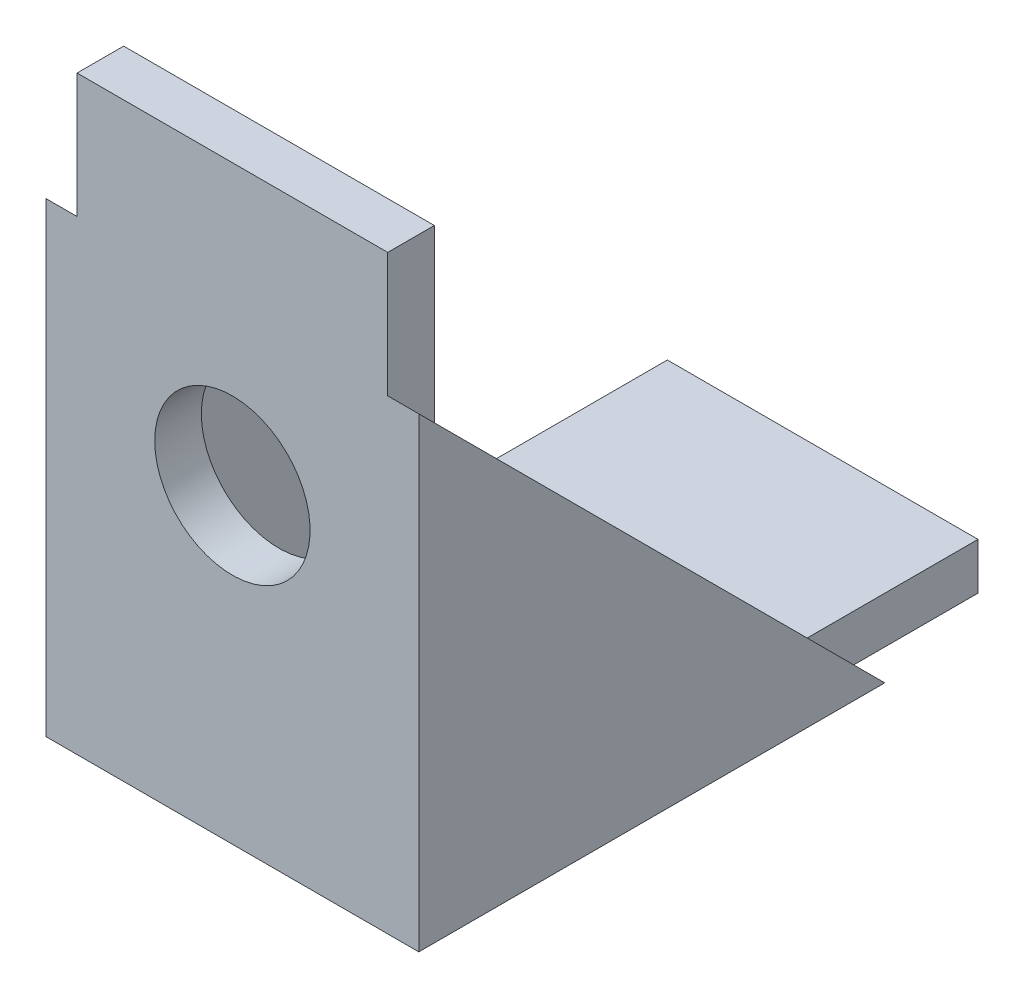
ISO-10303-21;
HEADER;
FILE_DESCRIPTION(('STEP AP214'),'2;1');
FILE_NAME('part.step','',(''),(''),'','','');
FILE_SCHEMA(('AUTOMOTIVE_DESIGN { 1 0 10303 214 1 1 1 1 }'));
ENDSEC;
DATA;
#1=APPLICATION_CONTEXT('core data for automotive mechanical design processes');
#2=APPLICATION_PROTOCOL_DEFINITION('international standard','automotive_design',2000,#1);
#3=PRODUCT_CONTEXT('',#1,'mechanical');
#4=PRODUCT('Part','Part','',(#3));
#5=PRODUCT_RELATED_PRODUCT_CATEGORY('part','',(#4));
#6=PRODUCT_DEFINITION_FORMATION('','',#4);
#7=PRODUCT_DEFINITION_CONTEXT('part definition',#1,'design');
#8=PRODUCT_DEFINITION('design','',#6,#7);
#9=PRODUCT_DEFINITION_SHAPE('','',#8);
#10=(LENGTH_UNIT() NAMED_UNIT(*) SI_UNIT(.MILLI.,.METRE.));
#11=(NAMED_UNIT(*) PLANE_ANGLE_UNIT() SI_UNIT($,.RADIAN.));
#12=(NAMED_UNIT(*) SI_UNIT($,.STERADIAN.) SOLID_ANGLE_UNIT());
#13=UNCERTAINTY_MEASURE_WITH_UNIT(LENGTH_MEASURE(1.E-05),#10,'distance_accuracy_value','');
#14=(GEOMETRIC_REPRESENTATION_CONTEXT(3) GLOBAL_UNCERTAINTY_ASSIGNED_CONTEXT((#13)) GLOBAL_UNIT_ASSIGNED_CONTEXT((#10,
#11,#12)) REPRESENTATION_CONTEXT('',''));
#15=CARTESIAN_POINT('',(0.,0.,0.));
#16=DIRECTION('',(0.,0.,1.));
#17=DIRECTION('',(1.,0.,0.));
#18=AXIS2_PLACEMENT_3D('',#15,#16,#17);
#19=CARTESIAN_POINT('',(20.,0.,0.));
#20=DIRECTION('',(-1.,0.,0.));
#21=DIRECTION('',(0.,0.,1.));
#22=AXIS2_PLACEMENT_3D('',#19,#20,#21);
#23=PLANE('',#22);
#24=DIRECTION('',(0.,0.707106781186547,0.707106781186548));
#25=VECTOR('',#24,1.);
#26=CARTESIAN_POINT('',(20.,30.,0.));
#27=LINE('',#26,#25);
#28=CARTESIAN_POINT('',(20.,0.,-30.));
#29=VERTEX_POINT('',#28);
#30=CARTESIAN_POINT('',(20.,3.,-27.));
#31=VERTEX_POINT('',#30);
#32=EDGE_CURVE('E44',#29,#31,#27,.T.);
#33=ORIENTED_EDGE('',*,*,#32,.F.);
#34=DIRECTION('',(0.,0.,-1.));
#35=VECTOR('',#34,1.);
#36=CARTESIAN_POINT('',(20.,0.,-38.));
#37=LINE('',#36,#35);
#38=CARTESIAN_POINT('',(20.,0.,-38.));
#39=VERTEX_POINT('',#38);
#40=EDGE_CURVE('E145',#29,#39,#37,.T.);
#41=ORIENTED_EDGE('',*,*,#40,.T.);
#42=DIRECTION('',(0.,1.,0.));
#43=VECTOR('',#42,1.);
#44=CARTESIAN_POINT('',(20.,3.,-38.));
#45=LINE('',#44,#43);
#46=CARTESIAN_POINT('',(20.,3.,-38.));
#47=VERTEX_POINT('',#46);
#48=EDGE_CURVE('E199',#39,#47,#45,.T.);
#49=ORIENTED_EDGE('',*,*,#48,.T.);
#50=DIRECTION('',(0.,0.,1.));
#51=VECTOR('',#50,1.);
#52=CARTESIAN_POINT('',(20.,3.,-3.));
#53=LINE('',#52,#51);
#54=EDGE_CURVE('E202',#47,#31,#53,.T.);
#55=ORIENTED_EDGE('',*,*,#54,.T.);
#56=EDGE_LOOP('',(#33,#41,#49,#55));
#57=FACE_BOUND('',#56,.T.);
#58=ADVANCED_FACE('F33',(#57),#23,.F.);
#59=CARTESIAN_POINT('',(20.,27.,-3.));
#60=VERTEX_POINT('',#59);
#61=CARTESIAN_POINT('',(20.,30.,0.));
#62=VERTEX_POINT('',#61);
#63=EDGE_CURVE('E11',#60,#62,#27,.T.);
#64=ORIENTED_EDGE('',*,*,#63,.F.);
#65=DIRECTION('',(0.,1.,0.));
#66=VECTOR('',#65,1.);
#67=CARTESIAN_POINT('',(20.,38.,-3.));
#68=LINE('',#67,#66);
#69=CARTESIAN_POINT('',(20.,38.,-3.));
#70=VERTEX_POINT('',#69);
#71=EDGE_CURVE('E204',#60,#70,#68,.T.);
#72=ORIENTED_EDGE('',*,*,#71,.T.);
#73=DIRECTION('',(0.,0.,1.));
#74=VECTOR('',#73,1.);
#75=CARTESIAN_POINT('',(20.,38.,0.));
#76=LINE('',#75,#74);
#77=CARTESIAN_POINT('',(20.,38.,0.));
#78=VERTEX_POINT('',#77);
#79=EDGE_CURVE('E208',#70,#78,#76,.T.);
#80=ORIENTED_EDGE('',*,*,#79,.T.);
#81=DIRECTION('',(0.,-1.,0.));
#82=VECTOR('',#81,1.);
#83=CARTESIAN_POINT('',(20.,0.,0.));
#84=LINE('',#83,#82);
#85=EDGE_CURVE('E210',#78,#62,#84,.T.);
#86=ORIENTED_EDGE('',*,*,#85,.T.);
#87=EDGE_LOOP('',(#64,#72,#80,#86));
#88=FACE_BOUND('',#87,.T.);
#89=ADVANCED_FACE('F282',(#88),#23,.F.);
#90=CARTESIAN_POINT('',(0.,0.,0.));
#91=DIRECTION('',(-1.,0.,0.));
#92=DIRECTION('',(0.,0.,1.));
#93=AXIS2_PLACEMENT_3D('',#90,#91,#92);
#94=PLANE('',#93);
#95=DIRECTION('',(0.,-0.707106781186547,-0.707106781186547));
#96=VECTOR('',#95,1.);
#97=CARTESIAN_POINT('',(0.,30.,0.));
#98=LINE('',#97,#96);
#99=CARTESIAN_POINT('',(0.,30.,0.));
#100=VERTEX_POINT('',#99);
#101=CARTESIAN_POINT('',(0.,27.,-3.));
#102=VERTEX_POINT('',#101);
#103=EDGE_CURVE('E149',#100,#102,#98,.T.);
#104=ORIENTED_EDGE('',*,*,#103,.F.);
#105=DIRECTION('',(0.,-1.,0.));
#106=VECTOR('',#105,1.);
#107=CARTESIAN_POINT('',(0.,0.,0.));
#108=LINE('',#107,#106);
#109=CARTESIAN_POINT('',(0.,38.,0.));
#110=VERTEX_POINT('',#109);
#111=EDGE_CURVE('E200',#110,#100,#108,.T.);
#112=ORIENTED_EDGE('',*,*,#111,.F.);
#113=DIRECTION('',(0.,0.,1.));
#114=VECTOR('',#113,1.);
#115=CARTESIAN_POINT('',(0.,38.,0.));
#116=LINE('',#115,#114);
#117=CARTESIAN_POINT('',(0.,38.,-3.));
#118=VERTEX_POINT('',#117);
#119=EDGE_CURVE('E224',#118,#110,#116,.T.);
#120=ORIENTED_EDGE('',*,*,#119,.F.);
#121=DIRECTION('',(0.,1.,0.));
#122=VECTOR('',#121,1.);
#123=CARTESIAN_POINT('',(0.,38.,-3.));
#124=LINE('',#123,#122);
#125=EDGE_CURVE('E220',#102,#118,#124,.T.);
#126=ORIENTED_EDGE('',*,*,#125,.F.);
#127=EDGE_LOOP('',(#104,#112,#120,#126));
#128=FACE_BOUND('',#127,.T.);
#129=ADVANCED_FACE('F264',(#128),#94,.T.);
#130=CARTESIAN_POINT('',(20.,0.,-38.));
#131=DIRECTION('',(0.,1.,0.));
#132=DIRECTION('',(0.,0.,1.));
#133=AXIS2_PLACEMENT_3D('',#130,#131,#132);
#134=PLANE('',#133);
#135=CARTESIAN_POINT('',(4.,0.,-12.));
#136=DIRECTION('',(0.,1.,0.));
#137=DIRECTION('',(0.,0.,1.));
#138=AXIS2_PLACEMENT_3D('',#135,#136,#137);
#139=CIRCLE('',#138,1.5);
#140=CARTESIAN_POINT('',(4.,0.,-10.5));
#141=VERTEX_POINT('',#140);
#142=EDGE_CURVE('E174',#141,#141,#139,.T.);
#143=ORIENTED_EDGE('',*,*,#142,.T.);
#144=EDGE_LOOP('',(#143));
#145=FACE_BOUND('',#144,.T.);
#146=CARTESIAN_POINT('',(16.,0.,-24.));
#147=DIRECTION('',(0.,1.,0.));
#148=DIRECTION('',(0.,0.,1.));
#149=AXIS2_PLACEMENT_3D('',#146,#147,#148);
#150=CIRCLE('',#149,1.5);
#151=CARTESIAN_POINT('',(16.,0.,-22.5));
#152=VERTEX_POINT('',#151);
#153=EDGE_CURVE('E181',#152,#152,#150,.T.);
#154=ORIENTED_EDGE('',*,*,#153,.T.);
#155=EDGE_LOOP('',(#154));
#156=FACE_BOUND('',#155,.T.);
#157=CARTESIAN_POINT('',(4.,0.,-24.));
#158=DIRECTION('',(0.,1.,0.));
#159=DIRECTION('',(0.,0.,1.));
#160=AXIS2_PLACEMENT_3D('',#157,#158,#159);
#161=CIRCLE('',#160,1.5);
#162=CARTESIAN_POINT('',(4.,0.,-22.5));
#163=VERTEX_POINT('',#162);
#164=EDGE_CURVE('E187',#163,#163,#161,.T.);
#165=ORIENTED_EDGE('',*,*,#164,.T.);
#166=EDGE_LOOP('',(#165));
#167=FACE_BOUND('',#166,.T.);
#168=CARTESIAN_POINT('',(16.,0.,-12.));
#169=DIRECTION('',(0.,1.,0.));
#170=DIRECTION('',(0.,0.,1.));
#171=AXIS2_PLACEMENT_3D('',#168,#169,#170);
#172=CIRCLE('',#171,1.5);
#173=CARTESIAN_POINT('',(16.,0.,-10.5));
#174=VERTEX_POINT('',#173);
#175=EDGE_CURVE('E192',#174,#174,#172,.T.);
#176=ORIENTED_EDGE('',*,*,#175,.T.);
#177=EDGE_LOOP('',(#176));
#178=FACE_BOUND('',#177,.T.);
#179=DIRECTION('',(-1.,0.,0.));
#180=VECTOR('',#179,1.);
#181=CARTESIAN_POINT('',(20.,0.,0.));
#182=LINE('',#181,#180);
#183=CARTESIAN_POINT('',(22.,0.,0.));
#184=VERTEX_POINT('',#183);
#185=CARTESIAN_POINT('',(-2.,0.,0.));
#186=VERTEX_POINT('',#185);
#187=EDGE_CURVE('E212',#184,#186,#182,.T.);
#188=ORIENTED_EDGE('',*,*,#187,.T.);
#189=DIRECTION('',(0.,0.,1.));
#190=VECTOR('',#189,1.);
#191=CARTESIAN_POINT('',(-2.,0.,-30.));
#192=LINE('',#191,#190);
#193=CARTESIAN_POINT('',(-2.,0.,-30.));
#194=VERTEX_POINT('',#193);
#195=EDGE_CURVE('E153',#194,#186,#192,.T.);
#196=ORIENTED_EDGE('',*,*,#195,.F.);
#197=DIRECTION('',(1.,0.,0.));
#198=VECTOR('',#197,1.);
#199=CARTESIAN_POINT('',(-2.,0.,-30.));
#200=LINE('',#199,#198);
#201=CARTESIAN_POINT('',(0.,0.,-30.));
#202=VERTEX_POINT('',#201);
#203=EDGE_CURVE('E159',#194,#202,#200,.T.);
#204=ORIENTED_EDGE('',*,*,#203,.T.);
#205=DIRECTION('',(0.,0.,-1.));
#206=VECTOR('',#205,1.);
#207=CARTESIAN_POINT('',(0.,0.,-38.));
#208=LINE('',#207,#206);
#209=CARTESIAN_POINT('',(0.,0.,-38.));
#210=VERTEX_POINT('',#209);
#211=EDGE_CURVE('E195',#202,#210,#208,.T.);
#212=ORIENTED_EDGE('',*,*,#211,.T.);
#213=DIRECTION('',(-1.,0.,0.));
#214=VECTOR('',#213,1.);
#215=CARTESIAN_POINT('',(20.,0.,-38.));
#216=LINE('',#215,#214);
#217=EDGE_CURVE('E37',#39,#210,#216,.T.);
#218=ORIENTED_EDGE('',*,*,#217,.F.);
#219=ORIENTED_EDGE('',*,*,#40,.F.);
#220=DIRECTION('',(-1.,0.,0.));
#221=VECTOR('',#220,1.);
#222=CARTESIAN_POINT('',(22.,0.,-30.));
#223=LINE('',#222,#221);
#224=CARTESIAN_POINT('',(22.,0.,-30.));
#225=VERTEX_POINT('',#224);
#226=EDGE_CURVE('E130',#225,#29,#223,.T.);
#227=ORIENTED_EDGE('',*,*,#226,.F.);
#228=DIRECTION('',(0.,0.,-1.));
#229=VECTOR('',#228,1.);
#230=CARTESIAN_POINT('',(22.,0.,-30.));
#231=LINE('',#230,#229);
#232=EDGE_CURVE('E137',#184,#225,#231,.T.);
#233=ORIENTED_EDGE('',*,*,#232,.F.);
#234=EDGE_LOOP('',(#188,#196,#204,#212,#218,#219,#227,#233));
#235=FACE_BOUND('',#234,.T.);
#236=ADVANCED_FACE('F35',(#145,#156,#167,#178,#235),#134,.F.);
#237=CARTESIAN_POINT('',(20.,3.,-38.));
#238=DIRECTION('',(0.,0.,1.));
#239=DIRECTION('',(1.,0.,0.));
#240=AXIS2_PLACEMENT_3D('',#237,#238,#239);
#241=PLANE('',#240);
#242=DIRECTION('',(0.,1.,0.));
#243=VECTOR('',#242,1.);
#244=CARTESIAN_POINT('',(0.,3.,-38.));
#245=LINE('',#244,#243);
#246=CARTESIAN_POINT('',(0.,3.,-38.));
#247=VERTEX_POINT('',#246);
#248=EDGE_CURVE('E214',#210,#247,#245,.T.);
#249=ORIENTED_EDGE('',*,*,#248,.T.);
#250=DIRECTION('',(-1.,0.,0.));
#251=VECTOR('',#250,1.);
#252=CARTESIAN_POINT('',(20.,3.,-38.));
#253=LINE('',#252,#251);
#254=EDGE_CURVE('E237',#47,#247,#253,.T.);
#255=ORIENTED_EDGE('',*,*,#254,.F.);
#256=ORIENTED_EDGE('',*,*,#48,.F.);
#257=ORIENTED_EDGE('',*,*,#217,.T.);
#258=EDGE_LOOP('',(#249,#255,#256,#257));
#259=FACE_BOUND('',#258,.T.);
#260=ADVANCED_FACE('F275',(#259),#241,.F.);
#261=CARTESIAN_POINT('',(20.,3.,-3.));
#262=DIRECTION('',(0.,-1.,0.));
#263=DIRECTION('',(0.,0.,-1.));
#264=AXIS2_PLACEMENT_3D('',#261,#262,#263);
#265=PLANE('',#264);
#266=CARTESIAN_POINT('',(4.,3.,-12.));
#267=DIRECTION('',(0.,1.,0.));
#268=DIRECTION('',(0.,0.,1.));
#269=AXIS2_PLACEMENT_3D('',#266,#267,#268);
#270=CIRCLE('',#269,1.5);
#271=CARTESIAN_POINT('',(4.,3.,-10.5));
#272=VERTEX_POINT('',#271);
#273=EDGE_CURVE('E178',#272,#272,#270,.T.);
#274=ORIENTED_EDGE('',*,*,#273,.F.);
#275=EDGE_LOOP('',(#274));
#276=FACE_BOUND('',#275,.T.);
#277=CARTESIAN_POINT('',(16.,3.,-24.));
#278=DIRECTION('',(0.,1.,0.));
#279=DIRECTION('',(0.,0.,1.));
#280=AXIS2_PLACEMENT_3D('',#277,#278,#279);
#281=CIRCLE('',#280,1.5);
#282=CARTESIAN_POINT('',(16.,3.,-22.5));
#283=VERTEX_POINT('',#282);
#284=EDGE_CURVE('E184',#283,#283,#281,.T.);
#285=ORIENTED_EDGE('',*,*,#284,.F.);
#286=EDGE_LOOP('',(#285));
#287=FACE_BOUND('',#286,.T.);
#288=CARTESIAN_POINT('',(4.,3.,-24.));
#289=DIRECTION('',(0.,1.,0.));
#290=DIRECTION('',(0.,0.,1.));
#291=AXIS2_PLACEMENT_3D('',#288,#289,#290);
#292=CIRCLE('',#291,1.5);
#293=CARTESIAN_POINT('',(4.,3.,-22.5));
#294=VERTEX_POINT('',#293);
#295=EDGE_CURVE('E171',#294,#294,#292,.T.);
#296=ORIENTED_EDGE('',*,*,#295,.F.);
#297=EDGE_LOOP('',(#296));
#298=FACE_BOUND('',#297,.T.);
#299=CARTESIAN_POINT('',(16.,3.,-12.));
#300=DIRECTION('',(0.,1.,0.));
#301=DIRECTION('',(0.,0.,1.));
#302=AXIS2_PLACEMENT_3D('',#299,#300,#301);
#303=CIRCLE('',#302,1.5);
#304=CARTESIAN_POINT('',(16.,3.,-10.5));
#305=VERTEX_POINT('',#304);
#306=EDGE_CURVE('E177',#305,#305,#303,.T.);
#307=ORIENTED_EDGE('',*,*,#306,.F.);
#308=EDGE_LOOP('',(#307));
#309=FACE_BOUND('',#308,.T.);
#310=DIRECTION('',(0.,0.,1.));
#311=VECTOR('',#310,1.);
#312=CARTESIAN_POINT('',(0.,3.,-3.));
#313=LINE('',#312,#311);
#314=CARTESIAN_POINT('',(0.,3.,-27.));
#315=VERTEX_POINT('',#314);
#316=EDGE_CURVE('E217',#247,#315,#313,.T.);
#317=ORIENTED_EDGE('',*,*,#316,.T.);
#318=CARTESIAN_POINT('',(0.,3.,-3.));
#319=VERTEX_POINT('',#318);
#320=EDGE_CURVE('E216',#315,#319,#313,.T.);
#321=ORIENTED_EDGE('',*,*,#320,.T.);
#322=DIRECTION('',(-1.,0.,0.));
#323=VECTOR('',#322,1.);
#324=CARTESIAN_POINT('',(20.,3.,-3.));
#325=LINE('',#324,#323);
#326=CARTESIAN_POINT('',(20.,3.,-3.));
#327=VERTEX_POINT('',#326);
#328=EDGE_CURVE('E235',#327,#319,#325,.T.);
#329=ORIENTED_EDGE('',*,*,#328,.F.);
#330=EDGE_CURVE('E58',#31,#327,#53,.T.);
#331=ORIENTED_EDGE('',*,*,#330,.F.);
#332=ORIENTED_EDGE('',*,*,#54,.F.);
#333=ORIENTED_EDGE('',*,*,#254,.T.);
#334=EDGE_LOOP('',(#317,#321,#329,#331,#332,#333));
#335=FACE_BOUND('',#334,.T.);
#336=ADVANCED_FACE('F273',(#276,#287,#298,#309,#335),#265,.F.);
#337=CARTESIAN_POINT('',(20.,38.,-3.));
#338=DIRECTION('',(0.,0.,1.));
#339=DIRECTION('',(1.,0.,0.));
#340=AXIS2_PLACEMENT_3D('',#337,#338,#339);
#341=PLANE('',#340);
#342=CARTESIAN_POINT('',(10.,20.,-3.));
#343=DIRECTION('',(0.,0.,-1.));
#344=DIRECTION('',(-1.,0.,0.));
#345=AXIS2_PLACEMENT_3D('',#342,#343,#344);
#346=CIRCLE('',#345,5.);
#347=CARTESIAN_POINT('',(5.,20.,-3.));
#348=VERTEX_POINT('',#347);
#349=EDGE_CURVE('E167',#348,#348,#346,.T.);
#350=ORIENTED_EDGE('',*,*,#349,.F.);
#351=EDGE_LOOP('',(#350));
#352=FACE_BOUND('',#351,.T.);
#353=EDGE_CURVE('E221',#319,#102,#124,.T.);
#354=ORIENTED_EDGE('',*,*,#353,.T.);
#355=ORIENTED_EDGE('',*,*,#125,.T.);
#356=DIRECTION('',(-1.,0.,0.));
#357=VECTOR('',#356,1.);
#358=CARTESIAN_POINT('',(20.,38.,-3.));
#359=LINE('',#358,#357);
#360=EDGE_CURVE('E232',#70,#118,#359,.T.);
#361=ORIENTED_EDGE('',*,*,#360,.F.);
#362=ORIENTED_EDGE('',*,*,#71,.F.);
#363=EDGE_CURVE('E205',#327,#60,#68,.T.);
#364=ORIENTED_EDGE('',*,*,#363,.F.);
#365=ORIENTED_EDGE('',*,*,#328,.T.);
#366=EDGE_LOOP('',(#354,#355,#361,#362,#364,#365));
#367=FACE_BOUND('',#366,.T.);
#368=ADVANCED_FACE('F268',(#352,#367),#341,.F.);
#369=CARTESIAN_POINT('',(20.,38.,0.));
#370=DIRECTION('',(0.,-1.,0.));
#371=DIRECTION('',(0.,0.,-1.));
#372=AXIS2_PLACEMENT_3D('',#369,#370,#371);
#373=PLANE('',#372);
#374=ORIENTED_EDGE('',*,*,#119,.T.);
#375=DIRECTION('',(-1.,0.,0.));
#376=VECTOR('',#375,1.);
#377=CARTESIAN_POINT('',(20.,38.,0.));
#378=LINE('',#377,#376);
#379=EDGE_CURVE('E229',#78,#110,#378,.T.);
#380=ORIENTED_EDGE('',*,*,#379,.F.);
#381=ORIENTED_EDGE('',*,*,#79,.F.);
#382=ORIENTED_EDGE('',*,*,#360,.T.);
#383=EDGE_LOOP('',(#374,#380,#381,#382));
#384=FACE_BOUND('',#383,.T.);
#385=ADVANCED_FACE('F285',(#384),#373,.F.);
#386=CARTESIAN_POINT('',(20.,0.,0.));
#387=DIRECTION('',(0.,0.,-1.));
#388=DIRECTION('',(-1.,0.,0.));
#389=AXIS2_PLACEMENT_3D('',#386,#387,#388);
#390=PLANE('',#389);
#391=CARTESIAN_POINT('',(10.,20.,0.));
#392=DIRECTION('',(0.,0.,-1.));
#393=DIRECTION('',(-1.,0.,0.));
#394=AXIS2_PLACEMENT_3D('',#391,#392,#393);
#395=CIRCLE('',#394,5.);
#396=CARTESIAN_POINT('',(5.,20.,0.));
#397=VERTEX_POINT('',#396);
#398=EDGE_CURVE('E168',#397,#397,#395,.T.);
#399=ORIENTED_EDGE('',*,*,#398,.T.);
#400=EDGE_LOOP('',(#399));
#401=FACE_BOUND('',#400,.T.);
#402=ORIENTED_EDGE('',*,*,#111,.T.);
#403=DIRECTION('',(1.,0.,0.));
#404=VECTOR('',#403,1.);
#405=CARTESIAN_POINT('',(-2.,30.,0.));
#406=LINE('',#405,#404);
#407=CARTESIAN_POINT('',(-2.,30.,0.));
#408=VERTEX_POINT('',#407);
#409=EDGE_CURVE('E164',#408,#100,#406,.T.);
#410=ORIENTED_EDGE('',*,*,#409,.F.);
#411=DIRECTION('',(0.,1.,0.));
#412=VECTOR('',#411,1.);
#413=CARTESIAN_POINT('',(-2.,0.,0.));
#414=LINE('',#413,#412);
#415=EDGE_CURVE('E156',#186,#408,#414,.T.);
#416=ORIENTED_EDGE('',*,*,#415,.F.);
#417=ORIENTED_EDGE('',*,*,#187,.F.);
#418=DIRECTION('',(0.,-1.,0.));
#419=VECTOR('',#418,1.);
#420=CARTESIAN_POINT('',(22.,0.,0.));
#421=LINE('',#420,#419);
#422=CARTESIAN_POINT('',(22.,30.,0.));
#423=VERTEX_POINT('',#422);
#424=EDGE_CURVE('E136',#423,#184,#421,.T.);
#425=ORIENTED_EDGE('',*,*,#424,.F.);
#426=DIRECTION('',(-1.,0.,0.));
#427=VECTOR('',#426,1.);
#428=CARTESIAN_POINT('',(22.,30.,0.));
#429=LINE('',#428,#427);
#430=EDGE_CURVE('E132',#423,#62,#429,.T.);
#431=ORIENTED_EDGE('',*,*,#430,.T.);
#432=ORIENTED_EDGE('',*,*,#85,.F.);
#433=ORIENTED_EDGE('',*,*,#379,.T.);
#434=EDGE_LOOP('',(#402,#410,#416,#417,#425,#431,#432,#433));
#435=FACE_BOUND('',#434,.T.);
#436=ADVANCED_FACE('F258',(#401,#435),#390,.F.);
#437=EDGE_CURVE('E42',#315,#202,#98,.T.);
#438=ORIENTED_EDGE('',*,*,#437,.F.);
#439=ORIENTED_EDGE('',*,*,#316,.F.);
#440=ORIENTED_EDGE('',*,*,#248,.F.);
#441=ORIENTED_EDGE('',*,*,#211,.F.);
#442=EDGE_LOOP('',(#438,#439,#440,#441));
#443=FACE_BOUND('',#442,.T.);
#444=ADVANCED_FACE('F274',(#443),#94,.T.);
#445=CARTESIAN_POINT('',(16.,0.,-12.));
#446=DIRECTION('',(0.,1.,0.));
#447=DIRECTION('',(0.,0.,1.));
#448=AXIS2_PLACEMENT_3D('',#445,#446,#447);
#449=CYLINDRICAL_SURFACE('',#448,1.5);
#450=ORIENTED_EDGE('',*,*,#175,.F.);
#451=EDGE_LOOP('',(#450));
#452=FACE_BOUND('',#451,.T.);
#453=ORIENTED_EDGE('',*,*,#306,.T.);
#454=EDGE_LOOP('',(#453));
#455=FACE_BOUND('',#454,.T.);
#456=ADVANCED_FACE('F303',(#452,#455),#449,.F.);
#457=CARTESIAN_POINT('',(4.,0.,-24.));
#458=DIRECTION('',(0.,1.,0.));
#459=DIRECTION('',(0.,0.,1.));
#460=AXIS2_PLACEMENT_3D('',#457,#458,#459);
#461=CYLINDRICAL_SURFACE('',#460,1.5);
#462=ORIENTED_EDGE('',*,*,#164,.F.);
#463=EDGE_LOOP('',(#462));
#464=FACE_BOUND('',#463,.T.);
#465=ORIENTED_EDGE('',*,*,#295,.T.);
#466=EDGE_LOOP('',(#465));
#467=FACE_BOUND('',#466,.T.);
#468=ADVANCED_FACE('F309',(#464,#467),#461,.F.);
#469=CARTESIAN_POINT('',(16.,0.,-24.));
#470=DIRECTION('',(0.,1.,0.));
#471=DIRECTION('',(0.,0.,1.));
#472=AXIS2_PLACEMENT_3D('',#469,#470,#471);
#473=CYLINDRICAL_SURFACE('',#472,1.5);
#474=ORIENTED_EDGE('',*,*,#153,.F.);
#475=EDGE_LOOP('',(#474));
#476=FACE_BOUND('',#475,.T.);
#477=ORIENTED_EDGE('',*,*,#284,.T.);
#478=EDGE_LOOP('',(#477));
#479=FACE_BOUND('',#478,.T.);
#480=ADVANCED_FACE('F341',(#476,#479),#473,.F.);
#481=CARTESIAN_POINT('',(4.,0.,-12.));
#482=DIRECTION('',(0.,1.,0.));
#483=DIRECTION('',(0.,0.,1.));
#484=AXIS2_PLACEMENT_3D('',#481,#482,#483);
#485=CYLINDRICAL_SURFACE('',#484,1.5);
#486=ORIENTED_EDGE('',*,*,#142,.F.);
#487=EDGE_LOOP('',(#486));
#488=FACE_BOUND('',#487,.T.);
#489=ORIENTED_EDGE('',*,*,#273,.T.);
#490=EDGE_LOOP('',(#489));
#491=FACE_BOUND('',#490,.T.);
#492=ADVANCED_FACE('F346',(#488,#491),#485,.F.);
#493=CARTESIAN_POINT('',(10.,20.,0.));
#494=DIRECTION('',(0.,0.,-1.));
#495=DIRECTION('',(-1.,0.,0.));
#496=AXIS2_PLACEMENT_3D('',#493,#494,#495);
#497=CYLINDRICAL_SURFACE('',#496,5.);
#498=ORIENTED_EDGE('',*,*,#398,.F.);
#499=EDGE_LOOP('',(#498));
#500=FACE_BOUND('',#499,.T.);
#501=ORIENTED_EDGE('',*,*,#349,.T.);
#502=EDGE_LOOP('',(#501));
#503=FACE_BOUND('',#502,.T.);
#504=ADVANCED_FACE('F352',(#500,#503),#497,.F.);
#505=CARTESIAN_POINT('',(-2.,30.,0.));
#506=DIRECTION('',(0.,-0.707106781186547,0.707106781186547));
#507=DIRECTION('',(0.,-0.707106781186548,-0.707106781186548));
#508=AXIS2_PLACEMENT_3D('',#505,#506,#507);
#509=PLANE('',#508);
#510=ORIENTED_EDGE('',*,*,#103,.T.);
#511=EDGE_CURVE('E146',#102,#315,#98,.T.);
#512=ORIENTED_EDGE('',*,*,#511,.T.);
#513=ORIENTED_EDGE('',*,*,#437,.T.);
#514=ORIENTED_EDGE('',*,*,#203,.F.);
#515=DIRECTION('',(0.,-0.707106781186547,-0.707106781186547));
#516=VECTOR('',#515,1.);
#517=CARTESIAN_POINT('',(-2.,30.,0.));
#518=LINE('',#517,#516);
#519=EDGE_CURVE('E158',#408,#194,#518,.T.);
#520=ORIENTED_EDGE('',*,*,#519,.F.);
#521=ORIENTED_EDGE('',*,*,#409,.T.);
#522=EDGE_LOOP('',(#510,#512,#513,#514,#520,#521));
#523=FACE_BOUND('',#522,.T.);
#524=ADVANCED_FACE('F247',(#523),#509,.F.);
#525=CARTESIAN_POINT('',(-2.,0.,0.));
#526=DIRECTION('',(-1.,0.,0.));
#527=DIRECTION('',(0.,0.,1.));
#528=AXIS2_PLACEMENT_3D('',#525,#526,#527);
#529=PLANE('',#528);
#530=ORIENTED_EDGE('',*,*,#195,.T.);
#531=ORIENTED_EDGE('',*,*,#415,.T.);
#532=ORIENTED_EDGE('',*,*,#519,.T.);
#533=EDGE_LOOP('',(#530,#531,#532));
#534=FACE_BOUND('',#533,.T.);
#535=ADVANCED_FACE('F255',(#534),#529,.T.);
#536=CARTESIAN_POINT('',(0.,0.,0.));
#537=DIRECTION('',(-1.,0.,0.));
#538=DIRECTION('',(0.,0.,1.));
#539=AXIS2_PLACEMENT_3D('',#536,#537,#538);
#540=PLANE('',#539);
#541=ORIENTED_EDGE('',*,*,#353,.F.);
#542=ORIENTED_EDGE('',*,*,#320,.F.);
#543=ORIENTED_EDGE('',*,*,#511,.F.);
#544=EDGE_LOOP('',(#541,#542,#543));
#545=FACE_BOUND('',#544,.T.);
#546=ADVANCED_FACE('F272',(#545),#540,.F.);
#547=CARTESIAN_POINT('',(22.,30.,0.));
#548=DIRECTION('',(0.,-0.707106781186548,0.707106781186547));
#549=DIRECTION('',(0.,-0.707106781186547,-0.707106781186548));
#550=AXIS2_PLACEMENT_3D('',#547,#548,#549);
#551=PLANE('',#550);
#552=ORIENTED_EDGE('',*,*,#32,.T.);
#553=EDGE_CURVE('E45',#31,#60,#27,.T.);
#554=ORIENTED_EDGE('',*,*,#553,.T.);
#555=ORIENTED_EDGE('',*,*,#63,.T.);
#556=ORIENTED_EDGE('',*,*,#430,.F.);
#557=DIRECTION('',(0.,0.707106781186547,0.707106781186548));
#558=VECTOR('',#557,1.);
#559=CARTESIAN_POINT('',(22.,30.,0.));
#560=LINE('',#559,#558);
#561=EDGE_CURVE('E125',#225,#423,#560,.T.);
#562=ORIENTED_EDGE('',*,*,#561,.F.);
#563=ORIENTED_EDGE('',*,*,#226,.T.);
#564=EDGE_LOOP('',(#552,#554,#555,#556,#562,#563));
#565=FACE_BOUND('',#564,.T.);
#566=ADVANCED_FACE('F128',(#565),#551,.F.);
#567=CARTESIAN_POINT('',(22.,0.,0.));
#568=DIRECTION('',(-1.,0.,0.));
#569=DIRECTION('',(0.,0.,1.));
#570=AXIS2_PLACEMENT_3D('',#567,#568,#569);
#571=PLANE('',#570);
#572=ORIENTED_EDGE('',*,*,#232,.T.);
#573=ORIENTED_EDGE('',*,*,#561,.T.);
#574=ORIENTED_EDGE('',*,*,#424,.T.);
#575=EDGE_LOOP('',(#572,#573,#574));
#576=FACE_BOUND('',#575,.T.);
#577=ADVANCED_FACE('F140',(#576),#571,.F.);
#578=CARTESIAN_POINT('',(20.,0.,0.));
#579=DIRECTION('',(-1.,0.,0.));
#580=DIRECTION('',(0.,0.,1.));
#581=AXIS2_PLACEMENT_3D('',#578,#579,#580);
#582=PLANE('',#581);
#583=ORIENTED_EDGE('',*,*,#553,.F.);
#584=ORIENTED_EDGE('',*,*,#330,.T.);
#585=ORIENTED_EDGE('',*,*,#363,.T.);
#586=EDGE_LOOP('',(#583,#584,#585));
#587=FACE_BOUND('',#586,.T.);
#588=ADVANCED_FACE('F280',(#587),#582,.T.);
#589=CLOSED_SHELL('',(#58,#89,#129,#236,#260,#336,#368,#385,#436,#444,#456,#468,#480,#492,#504,
#524,#535,#546,#566,#577,#588));
#590=MANIFOLD_SOLID_BREP('B2',#589);
#591=ADVANCED_BREP_SHAPE_REPRESENTATION('',(#18,#590),#14);
#592=SHAPE_DEFINITION_REPRESENTATION(#9,#591);
ENDSEC;
END-ISO-10303-21;
